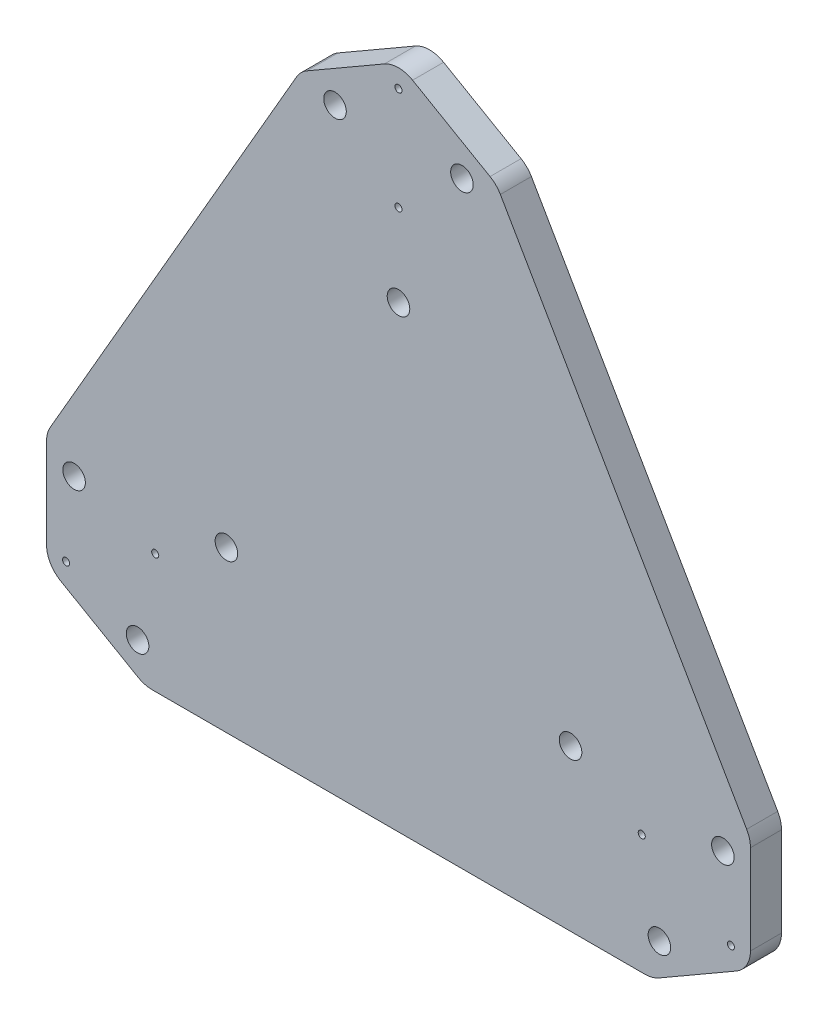
ISO-10303-21;
HEADER;
FILE_DESCRIPTION(('STEP AP214'),'2;1');
FILE_NAME('part.step','',(''),(''),'','','');
FILE_SCHEMA(('AUTOMOTIVE_DESIGN { 1 0 10303 214 1 1 1 1 }'));
ENDSEC;
DATA;
#1=APPLICATION_CONTEXT('core data for automotive mechanical design processes');
#2=APPLICATION_PROTOCOL_DEFINITION('international standard','automotive_design',2000,#1);
#3=PRODUCT_CONTEXT('',#1,'mechanical');
#4=PRODUCT('Part','Part','',(#3));
#5=PRODUCT_RELATED_PRODUCT_CATEGORY('part','',(#4));
#6=PRODUCT_DEFINITION_FORMATION('','',#4);
#7=PRODUCT_DEFINITION_CONTEXT('part definition',#1,'design');
#8=PRODUCT_DEFINITION('design','',#6,#7);
#9=PRODUCT_DEFINITION_SHAPE('','',#8);
#10=(LENGTH_UNIT() NAMED_UNIT(*) SI_UNIT(.MILLI.,.METRE.));
#11=(NAMED_UNIT(*) PLANE_ANGLE_UNIT() SI_UNIT($,.RADIAN.));
#12=(NAMED_UNIT(*) SI_UNIT($,.STERADIAN.) SOLID_ANGLE_UNIT());
#13=UNCERTAINTY_MEASURE_WITH_UNIT(LENGTH_MEASURE(1.E-05),#10,'distance_accuracy_value','');
#14=(GEOMETRIC_REPRESENTATION_CONTEXT(3) GLOBAL_UNCERTAINTY_ASSIGNED_CONTEXT((#13)) GLOBAL_UNIT_ASSIGNED_CONTEXT((#10,
#11,#12)) REPRESENTATION_CONTEXT('',''));
#15=CARTESIAN_POINT('',(0.,0.,0.));
#16=DIRECTION('',(0.,0.,1.));
#17=DIRECTION('',(1.,0.,0.));
#18=AXIS2_PLACEMENT_3D('',#15,#16,#17);
#19=CARTESIAN_POINT('',(0.,0.,11.));
#20=DIRECTION('',(0.,0.,-1.));
#21=DIRECTION('',(-1.,0.,0.));
#22=AXIS2_PLACEMENT_3D('',#19,#20,#21);
#23=PLANE('',#22);
#24=CARTESIAN_POINT('',(92.5,-79.3856620135732,11.));
#25=DIRECTION('',(0.,0.,1.));
#26=DIRECTION('',(1.,0.,0.));
#27=AXIS2_PLACEMENT_3D('',#24,#25,#26);
#28=CIRCLE('',#27,3.99999999999999);
#29=CARTESIAN_POINT('',(96.5,-79.3856620135732,11.));
#30=VERTEX_POINT('',#29);
#31=EDGE_CURVE('E389',#30,#30,#28,.T.);
#32=ORIENTED_EDGE('',*,*,#31,.F.);
#33=EDGE_LOOP('',(#32));
#34=FACE_BOUND('',#33,.T.);
#35=CARTESIAN_POINT('',(-115.,-40.4145188432734,11.));
#36=DIRECTION('',(0.,0.,1.));
#37=DIRECTION('',(1.,0.,0.));
#38=AXIS2_PLACEMENT_3D('',#35,#36,#37);
#39=CIRCLE('',#38,4.00000000000001);
#40=CARTESIAN_POINT('',(-111.,-40.4145188432734,11.));
#41=VERTEX_POINT('',#40);
#42=EDGE_CURVE('E377',#41,#41,#39,.T.);
#43=ORIENTED_EDGE('',*,*,#42,.F.);
#44=EDGE_LOOP('',(#43));
#45=FACE_BOUND('',#44,.T.);
#46=CARTESIAN_POINT('',(22.5,119.800180856848,11.));
#47=DIRECTION('',(0.,0.,1.));
#48=DIRECTION('',(1.,0.,0.));
#49=AXIS2_PLACEMENT_3D('',#46,#47,#48);
#50=CIRCLE('',#49,4.);
#51=CARTESIAN_POINT('',(26.5,119.800180856848,11.));
#52=VERTEX_POINT('',#51);
#53=EDGE_CURVE('E365',#52,#52,#50,.T.);
#54=ORIENTED_EDGE('',*,*,#53,.F.);
#55=EDGE_LOOP('',(#54));
#56=FACE_BOUND('',#55,.T.);
#57=CARTESIAN_POINT('',(0.,70.4367328411345,11.));
#58=DIRECTION('',(0.,0.,1.));
#59=DIRECTION('',(1.,0.,0.));
#60=AXIS2_PLACEMENT_3D('',#57,#58,#59);
#61=CIRCLE('',#60,4.);
#62=CARTESIAN_POINT('',(4.,70.4367328411345,11.));
#63=VERTEX_POINT('',#62);
#64=EDGE_CURVE('E353',#63,#63,#61,.T.);
#65=ORIENTED_EDGE('',*,*,#64,.F.);
#66=EDGE_LOOP('',(#65));
#67=FACE_BOUND('',#66,.T.);
#68=CARTESIAN_POINT('',(86.2400727618683,-49.7907292239972,11.));
#69=DIRECTION('',(0.,0.,1.));
#70=DIRECTION('',(1.,0.,0.));
#71=AXIS2_PLACEMENT_3D('',#68,#69,#70);
#72=CIRCLE('',#71,1.25);
#73=CARTESIAN_POINT('',(87.4900727618683,-49.7907292239972,11.));
#74=VERTEX_POINT('',#73);
#75=EDGE_CURVE('E341',#74,#74,#72,.T.);
#76=ORIENTED_EDGE('',*,*,#75,.F.);
#77=EDGE_LOOP('',(#76));
#78=FACE_BOUND('',#77,.T.);
#79=CARTESIAN_POINT('',(-86.2400727618682,-49.7907292239972,11.));
#80=DIRECTION('',(0.,0.,1.));
#81=DIRECTION('',(1.,0.,0.));
#82=AXIS2_PLACEMENT_3D('',#79,#80,#81);
#83=CIRCLE('',#82,1.24999999999995);
#84=CARTESIAN_POINT('',(-84.9900727618683,-49.7907292239972,11.));
#85=VERTEX_POINT('',#84);
#86=EDGE_CURVE('E329',#85,#85,#83,.T.);
#87=ORIENTED_EDGE('',*,*,#86,.F.);
#88=EDGE_LOOP('',(#87));
#89=FACE_BOUND('',#88,.T.);
#90=CARTESIAN_POINT('',(117.85,-68.0407292239971,11.));
#91=DIRECTION('',(0.,0.,1.));
#92=DIRECTION('',(1.,0.,0.));
#93=AXIS2_PLACEMENT_3D('',#90,#91,#92);
#94=CIRCLE('',#93,1.24999999999999);
#95=CARTESIAN_POINT('',(119.1,-68.0407292239971,11.));
#96=VERTEX_POINT('',#95);
#97=EDGE_CURVE('E317',#96,#96,#94,.T.);
#98=ORIENTED_EDGE('',*,*,#97,.F.);
#99=EDGE_LOOP('',(#98));
#100=FACE_BOUND('',#99,.T.);
#101=DIRECTION('',(0.866025403784438,-0.5,0.));
#102=VECTOR('',#101,1.);
#103=CARTESIAN_POINT('',(-90.,-92.1199342209286,11.));
#104=LINE('',#103,#102);
#105=CARTESIAN_POINT('',(-119.778203230276,-74.9274805699455,11.));
#106=VERTEX_POINT('',#105);
#107=CARTESIAN_POINT('',(-92.3205080756888,-90.780188258773,11.));
#108=VERTEX_POINT('',#107);
#109=EDGE_CURVE('E281',#106,#108,#104,.T.);
#110=ORIENTED_EDGE('',*,*,#109,.T.);
#111=CARTESIAN_POINT('',(-87.3205080756888,-82.1199342209286,11.));
#112=DIRECTION('',(0.,0.,-1.));
#113=DIRECTION('',(-1.,0.,0.));
#114=AXIS2_PLACEMENT_3D('',#111,#112,#113);
#115=CIRCLE('',#114,10.);
#116=CARTESIAN_POINT('',(-87.3205080756887,-92.1199342209286,11.));
#117=VERTEX_POINT('',#116);
#118=EDGE_CURVE('E235',#108,#117,#115,.F.);
#119=ORIENTED_EDGE('',*,*,#118,.T.);
#120=DIRECTION('',(1.,0.,0.));
#121=VECTOR('',#120,1.);
#122=CARTESIAN_POINT('',(90.,-92.1199342209285,11.));
#123=LINE('',#122,#121);
#124=CARTESIAN_POINT('',(87.3205080756887,-92.1199342209285,11.));
#125=VERTEX_POINT('',#124);
#126=EDGE_CURVE('E179',#117,#125,#123,.T.);
#127=ORIENTED_EDGE('',*,*,#126,.T.);
#128=CARTESIAN_POINT('',(87.3205080756887,-82.1199342209285,11.));
#129=DIRECTION('',(0.,0.,-1.));
#130=DIRECTION('',(-1.,0.,0.));
#131=AXIS2_PLACEMENT_3D('',#128,#129,#130);
#132=CIRCLE('',#131,10.);
#133=CARTESIAN_POINT('',(92.3205080756887,-90.780188258773,11.));
#134=VERTEX_POINT('',#133);
#135=EDGE_CURVE('E233',#125,#134,#132,.F.);
#136=ORIENTED_EDGE('',*,*,#135,.T.);
#137=DIRECTION('',(0.866025403784439,0.499999999999999,0.));
#138=VECTOR('',#137,1.);
#139=CARTESIAN_POINT('',(90.,-92.1199342209285,11.));
#140=LINE('',#139,#138);
#141=CARTESIAN_POINT('',(119.778203230276,-74.9274805699456,11.));
#142=VERTEX_POINT('',#141);
#143=EDGE_CURVE('E303',#134,#142,#140,.T.);
#144=ORIENTED_EDGE('',*,*,#143,.T.);
#145=CARTESIAN_POINT('',(114.778203230276,-66.2672265321012,11.));
#146=DIRECTION('',(0.,0.,-1.));
#147=DIRECTION('',(-1.,0.,0.));
#148=AXIS2_PLACEMENT_3D('',#145,#146,#147);
#149=CIRCLE('',#148,10.);
#150=CARTESIAN_POINT('',(124.778203230276,-66.2672265321012,11.));
#151=VERTEX_POINT('',#150);
#152=EDGE_CURVE('E222',#142,#151,#149,.F.);
#153=ORIENTED_EDGE('',*,*,#152,.T.);
#154=DIRECTION('',(0.,1.,0.));
#155=VECTOR('',#154,1.);
#156=CARTESIAN_POINT('',(124.778203230276,-31.8823192301352,11.));
#157=LINE('',#156,#155);
#158=CARTESIAN_POINT('',(124.778203230276,-34.5618111544465,11.));
#159=VERTEX_POINT('',#158);
#160=EDGE_CURVE('E301',#151,#159,#157,.T.);
#161=ORIENTED_EDGE('',*,*,#160,.T.);
#162=CARTESIAN_POINT('',(114.778203230276,-34.5618111544465,11.));
#163=DIRECTION('',(0.,0.,-1.));
#164=DIRECTION('',(-1.,0.,0.));
#165=AXIS2_PLACEMENT_3D('',#162,#163,#164);
#166=CIRCLE('',#165,10.);
#167=CARTESIAN_POINT('',(123.43845726812,-29.5618111544464,11.));
#168=VERTEX_POINT('',#167);
#169=EDGE_CURVE('E54',#159,#168,#166,.F.);
#170=ORIENTED_EDGE('',*,*,#169,.T.);
#171=DIRECTION('',(-0.5,0.866025403784439,0.));
#172=VECTOR('',#171,1.);
#173=CARTESIAN_POINT('',(34.7782032302756,124.002253451064,11.));
#174=LINE('',#173,#172);
#175=CARTESIAN_POINT('',(36.1179491924312,121.681745375375,11.));
#176=VERTEX_POINT('',#175);
#177=EDGE_CURVE('E201',#168,#176,#174,.T.);
#178=ORIENTED_EDGE('',*,*,#177,.T.);
#179=CARTESIAN_POINT('',(27.4576951545868,116.681745375375,11.));
#180=DIRECTION('',(0.,0.,-1.));
#181=DIRECTION('',(-1.,0.,0.));
#182=AXIS2_PLACEMENT_3D('',#179,#180,#181);
#183=CIRCLE('',#182,10.);
#184=CARTESIAN_POINT('',(32.4576951545868,125.341999413219,11.));
#185=VERTEX_POINT('',#184);
#186=EDGE_CURVE('E230',#176,#185,#183,.F.);
#187=ORIENTED_EDGE('',*,*,#186,.T.);
#188=DIRECTION('',(-0.866025403784438,0.500000000000001,0.));
#189=VECTOR('',#188,1.);
#190=CARTESIAN_POINT('',(34.7782032302756,124.002253451064,11.));
#191=LINE('',#190,#189);
#192=CARTESIAN_POINT('',(5.00000000000002,141.194707102047,11.));
#193=VERTEX_POINT('',#192);
#194=EDGE_CURVE('E200',#185,#193,#191,.T.);
#195=ORIENTED_EDGE('',*,*,#194,.T.);
#196=CARTESIAN_POINT('',(0.,132.534453064202,11.));
#197=DIRECTION('',(0.,0.,-1.));
#198=DIRECTION('',(-1.,0.,0.));
#199=AXIS2_PLACEMENT_3D('',#196,#197,#198);
#200=CIRCLE('',#199,10.);
#201=CARTESIAN_POINT('',(-5.00000000000002,141.194707102047,11.));
#202=VERTEX_POINT('',#201);
#203=EDGE_CURVE('E220',#193,#202,#200,.F.);
#204=ORIENTED_EDGE('',*,*,#203,.T.);
#205=DIRECTION('',(-0.866025403784439,-0.5,0.));
#206=VECTOR('',#205,1.);
#207=CARTESIAN_POINT('',(-34.7782032302757,124.002253451064,11.));
#208=LINE('',#207,#206);
#209=CARTESIAN_POINT('',(-32.4576951545869,125.341999413219,11.));
#210=VERTEX_POINT('',#209);
#211=EDGE_CURVE('E309',#202,#210,#208,.T.);
#212=ORIENTED_EDGE('',*,*,#211,.T.);
#213=CARTESIAN_POINT('',(-27.4576951545869,116.681745375375,11.));
#214=DIRECTION('',(0.,0.,-1.));
#215=DIRECTION('',(-1.,0.,0.));
#216=AXIS2_PLACEMENT_3D('',#213,#214,#215);
#217=CIRCLE('',#216,10.);
#218=CARTESIAN_POINT('',(-36.1179491924313,121.681745375375,11.));
#219=VERTEX_POINT('',#218);
#220=EDGE_CURVE('E228',#210,#219,#217,.F.);
#221=ORIENTED_EDGE('',*,*,#220,.T.);
#222=DIRECTION('',(-0.5,-0.866025403784439,0.));
#223=VECTOR('',#222,1.);
#224=CARTESIAN_POINT('',(-124.778203230276,-31.8823192301352,11.));
#225=LINE('',#224,#223);
#226=CARTESIAN_POINT('',(-123.43845726812,-29.5618111544465,11.));
#227=VERTEX_POINT('',#226);
#228=EDGE_CURVE('E282',#219,#227,#225,.T.);
#229=ORIENTED_EDGE('',*,*,#228,.T.);
#230=CARTESIAN_POINT('',(-114.778203230276,-34.5618111544464,11.));
#231=DIRECTION('',(0.,0.,-1.));
#232=DIRECTION('',(-1.,0.,0.));
#233=AXIS2_PLACEMENT_3D('',#230,#231,#232);
#234=CIRCLE('',#233,10.);
#235=CARTESIAN_POINT('',(-124.778203230276,-34.5618111544464,11.));
#236=VERTEX_POINT('',#235);
#237=EDGE_CURVE('E226',#227,#236,#234,.F.);
#238=ORIENTED_EDGE('',*,*,#237,.T.);
#239=DIRECTION('',(0.,-1.,0.));
#240=VECTOR('',#239,1.);
#241=CARTESIAN_POINT('',(-124.778203230276,-31.8823192301352,11.));
#242=LINE('',#241,#240);
#243=CARTESIAN_POINT('',(-124.778203230276,-66.2672265321011,11.));
#244=VERTEX_POINT('',#243);
#245=EDGE_CURVE('E271',#236,#244,#242,.T.);
#246=ORIENTED_EDGE('',*,*,#245,.T.);
#247=CARTESIAN_POINT('',(-114.778203230276,-66.2672265321011,11.));
#248=DIRECTION('',(0.,0.,-1.));
#249=DIRECTION('',(-1.,0.,0.));
#250=AXIS2_PLACEMENT_3D('',#247,#248,#249);
#251=CIRCLE('',#250,10.);
#252=EDGE_CURVE('E224',#244,#106,#251,.F.);
#253=ORIENTED_EDGE('',*,*,#252,.T.);
#254=EDGE_LOOP('',(#110,#119,#127,#136,#144,#153,#161,#170,#178,#187,#195,#204,#212,#221,#229,
#238,#246,#253));
#255=FACE_BOUND('',#254,.T.);
#256=CARTESIAN_POINT('',(-117.85,-68.0407292239972,11.));
#257=DIRECTION('',(0.,0.,1.));
#258=DIRECTION('',(1.,0.,0.));
#259=AXIS2_PLACEMENT_3D('',#256,#257,#258);
#260=CIRCLE('',#259,1.25000000000005);
#261=CARTESIAN_POINT('',(-116.6,-68.0407292239972,11.));
#262=VERTEX_POINT('',#261);
#263=EDGE_CURVE('E299',#262,#262,#260,.T.);
#264=ORIENTED_EDGE('',*,*,#263,.F.);
#265=EDGE_LOOP('',(#264));
#266=FACE_BOUND('',#265,.T.);
#267=CARTESIAN_POINT('',(0.,136.081458447995,11.));
#268=DIRECTION('',(0.,0.,1.));
#269=DIRECTION('',(1.,0.,0.));
#270=AXIS2_PLACEMENT_3D('',#267,#268,#269);
#271=CIRCLE('',#270,1.24999999999999);
#272=CARTESIAN_POINT('',(1.24999999999999,136.081458447995,11.));
#273=VERTEX_POINT('',#272);
#274=EDGE_CURVE('E323',#273,#273,#271,.T.);
#275=ORIENTED_EDGE('',*,*,#274,.F.);
#276=EDGE_LOOP('',(#275));
#277=FACE_BOUND('',#276,.T.);
#278=CARTESIAN_POINT('',(0.,99.5814584479949,11.));
#279=DIRECTION('',(0.,0.,1.));
#280=DIRECTION('',(1.,0.,0.));
#281=AXIS2_PLACEMENT_3D('',#278,#279,#280);
#282=CIRCLE('',#281,1.25000000000001);
#283=CARTESIAN_POINT('',(1.25000000000001,99.5814584479949,11.));
#284=VERTEX_POINT('',#283);
#285=EDGE_CURVE('E335',#284,#284,#282,.T.);
#286=ORIENTED_EDGE('',*,*,#285,.F.);
#287=EDGE_LOOP('',(#286));
#288=FACE_BOUND('',#287,.T.);
#289=CARTESIAN_POINT('',(-61.,-35.218366420567,11.));
#290=DIRECTION('',(0.,0.,1.));
#291=DIRECTION('',(1.,0.,0.));
#292=AXIS2_PLACEMENT_3D('',#289,#290,#291);
#293=CIRCLE('',#292,4.);
#294=CARTESIAN_POINT('',(-57.,-35.218366420567,11.));
#295=VERTEX_POINT('',#294);
#296=EDGE_CURVE('E347',#295,#295,#293,.T.);
#297=ORIENTED_EDGE('',*,*,#296,.F.);
#298=EDGE_LOOP('',(#297));
#299=FACE_BOUND('',#298,.T.);
#300=CARTESIAN_POINT('',(61.,-35.218366420567,11.));
#301=DIRECTION('',(0.,0.,1.));
#302=DIRECTION('',(1.,0.,0.));
#303=AXIS2_PLACEMENT_3D('',#300,#301,#302);
#304=CIRCLE('',#303,4.00000000000001);
#305=CARTESIAN_POINT('',(65.,-35.218366420567,11.));
#306=VERTEX_POINT('',#305);
#307=EDGE_CURVE('E359',#306,#306,#304,.T.);
#308=ORIENTED_EDGE('',*,*,#307,.F.);
#309=EDGE_LOOP('',(#308));
#310=FACE_BOUND('',#309,.T.);
#311=CARTESIAN_POINT('',(-22.5,119.800180856848,11.));
#312=DIRECTION('',(0.,0.,1.));
#313=DIRECTION('',(1.,0.,0.));
#314=AXIS2_PLACEMENT_3D('',#311,#312,#313);
#315=CIRCLE('',#314,4.);
#316=CARTESIAN_POINT('',(-18.5,119.800180856848,11.));
#317=VERTEX_POINT('',#316);
#318=EDGE_CURVE('E371',#317,#317,#315,.T.);
#319=ORIENTED_EDGE('',*,*,#318,.F.);
#320=EDGE_LOOP('',(#319));
#321=FACE_BOUND('',#320,.T.);
#322=CARTESIAN_POINT('',(-92.5,-79.3856620135732,11.));
#323=DIRECTION('',(0.,0.,1.));
#324=DIRECTION('',(1.,0.,0.));
#325=AXIS2_PLACEMENT_3D('',#322,#323,#324);
#326=CIRCLE('',#325,3.99999999999999);
#327=CARTESIAN_POINT('',(-88.5,-79.3856620135732,11.));
#328=VERTEX_POINT('',#327);
#329=EDGE_CURVE('E383',#328,#328,#326,.T.);
#330=ORIENTED_EDGE('',*,*,#329,.F.);
#331=EDGE_LOOP('',(#330));
#332=FACE_BOUND('',#331,.T.);
#333=CARTESIAN_POINT('',(115.,-40.4145188432734,11.));
#334=DIRECTION('',(0.,0.,1.));
#335=DIRECTION('',(1.,0.,0.));
#336=AXIS2_PLACEMENT_3D('',#333,#334,#335);
#337=CIRCLE('',#336,3.99999999999999);
#338=CARTESIAN_POINT('',(119.,-40.4145188432734,11.));
#339=VERTEX_POINT('',#338);
#340=EDGE_CURVE('E395',#339,#339,#337,.T.);
#341=ORIENTED_EDGE('',*,*,#340,.F.);
#342=EDGE_LOOP('',(#341));
#343=FACE_BOUND('',#342,.T.);
#344=ADVANCED_FACE('F32',(#34,#45,#56,#67,#78,#89,#100,#255,#266,#277,#288,#299,#310,#321,#332,
#343),#23,.F.);
#345=CARTESIAN_POINT('',(0.,0.,0.));
#346=DIRECTION('',(0.,0.,-1.));
#347=DIRECTION('',(-1.,0.,0.));
#348=AXIS2_PLACEMENT_3D('',#345,#346,#347);
#349=PLANE('',#348);
#350=CARTESIAN_POINT('',(92.5,-79.3856620135732,0.));
#351=DIRECTION('',(0.,0.,1.));
#352=DIRECTION('',(1.,0.,0.));
#353=AXIS2_PLACEMENT_3D('',#350,#351,#352);
#354=CIRCLE('',#353,3.99999999999999);
#355=CARTESIAN_POINT('',(96.5,-79.3856620135732,0.));
#356=VERTEX_POINT('',#355);
#357=EDGE_CURVE('E392',#356,#356,#354,.T.);
#358=ORIENTED_EDGE('',*,*,#357,.T.);
#359=EDGE_LOOP('',(#358));
#360=FACE_BOUND('',#359,.T.);
#361=CARTESIAN_POINT('',(-115.,-40.4145188432734,0.));
#362=DIRECTION('',(0.,0.,1.));
#363=DIRECTION('',(1.,0.,0.));
#364=AXIS2_PLACEMENT_3D('',#361,#362,#363);
#365=CIRCLE('',#364,4.00000000000001);
#366=CARTESIAN_POINT('',(-111.,-40.4145188432734,0.));
#367=VERTEX_POINT('',#366);
#368=EDGE_CURVE('E380',#367,#367,#365,.T.);
#369=ORIENTED_EDGE('',*,*,#368,.T.);
#370=EDGE_LOOP('',(#369));
#371=FACE_BOUND('',#370,.T.);
#372=CARTESIAN_POINT('',(22.5,119.800180856848,0.));
#373=DIRECTION('',(0.,0.,1.));
#374=DIRECTION('',(1.,0.,0.));
#375=AXIS2_PLACEMENT_3D('',#372,#373,#374);
#376=CIRCLE('',#375,4.);
#377=CARTESIAN_POINT('',(26.5,119.800180856848,0.));
#378=VERTEX_POINT('',#377);
#379=EDGE_CURVE('E368',#378,#378,#376,.T.);
#380=ORIENTED_EDGE('',*,*,#379,.T.);
#381=EDGE_LOOP('',(#380));
#382=FACE_BOUND('',#381,.T.);
#383=CARTESIAN_POINT('',(0.,70.4367328411345,0.));
#384=DIRECTION('',(0.,0.,1.));
#385=DIRECTION('',(1.,0.,0.));
#386=AXIS2_PLACEMENT_3D('',#383,#384,#385);
#387=CIRCLE('',#386,4.);
#388=CARTESIAN_POINT('',(4.,70.4367328411345,0.));
#389=VERTEX_POINT('',#388);
#390=EDGE_CURVE('E356',#389,#389,#387,.T.);
#391=ORIENTED_EDGE('',*,*,#390,.T.);
#392=EDGE_LOOP('',(#391));
#393=FACE_BOUND('',#392,.T.);
#394=CARTESIAN_POINT('',(86.2400727618683,-49.7907292239972,0.));
#395=DIRECTION('',(0.,0.,1.));
#396=DIRECTION('',(1.,0.,0.));
#397=AXIS2_PLACEMENT_3D('',#394,#395,#396);
#398=CIRCLE('',#397,1.25);
#399=CARTESIAN_POINT('',(87.4900727618683,-49.7907292239972,0.));
#400=VERTEX_POINT('',#399);
#401=EDGE_CURVE('E344',#400,#400,#398,.T.);
#402=ORIENTED_EDGE('',*,*,#401,.T.);
#403=EDGE_LOOP('',(#402));
#404=FACE_BOUND('',#403,.T.);
#405=CARTESIAN_POINT('',(-86.2400727618682,-49.7907292239972,0.));
#406=DIRECTION('',(0.,0.,1.));
#407=DIRECTION('',(1.,0.,0.));
#408=AXIS2_PLACEMENT_3D('',#405,#406,#407);
#409=CIRCLE('',#408,1.24999999999995);
#410=CARTESIAN_POINT('',(-84.9900727618683,-49.7907292239972,0.));
#411=VERTEX_POINT('',#410);
#412=EDGE_CURVE('E332',#411,#411,#409,.T.);
#413=ORIENTED_EDGE('',*,*,#412,.T.);
#414=EDGE_LOOP('',(#413));
#415=FACE_BOUND('',#414,.T.);
#416=CARTESIAN_POINT('',(117.85,-68.0407292239971,0.));
#417=DIRECTION('',(0.,0.,1.));
#418=DIRECTION('',(1.,0.,0.));
#419=AXIS2_PLACEMENT_3D('',#416,#417,#418);
#420=CIRCLE('',#419,1.24999999999999);
#421=CARTESIAN_POINT('',(119.1,-68.0407292239971,0.));
#422=VERTEX_POINT('',#421);
#423=EDGE_CURVE('E320',#422,#422,#420,.T.);
#424=ORIENTED_EDGE('',*,*,#423,.T.);
#425=EDGE_LOOP('',(#424));
#426=FACE_BOUND('',#425,.T.);
#427=DIRECTION('',(1.,0.,0.));
#428=VECTOR('',#427,1.);
#429=CARTESIAN_POINT('',(90.,-92.1199342209285,0.));
#430=LINE('',#429,#428);
#431=CARTESIAN_POINT('',(-87.3205080756887,-92.1199342209286,0.));
#432=VERTEX_POINT('',#431);
#433=CARTESIAN_POINT('',(87.3205080756887,-92.1199342209285,0.));
#434=VERTEX_POINT('',#433);
#435=EDGE_CURVE('E176',#432,#434,#430,.T.);
#436=ORIENTED_EDGE('',*,*,#435,.F.);
#437=CARTESIAN_POINT('',(-87.3205080756888,-82.1199342209286,0.));
#438=DIRECTION('',(0.,0.,-1.));
#439=DIRECTION('',(-1.,0.,0.));
#440=AXIS2_PLACEMENT_3D('',#437,#438,#439);
#441=CIRCLE('',#440,10.);
#442=CARTESIAN_POINT('',(-92.3205080756888,-90.780188258773,0.));
#443=VERTEX_POINT('',#442);
#444=EDGE_CURVE('E159',#432,#443,#441,.T.);
#445=ORIENTED_EDGE('',*,*,#444,.T.);
#446=DIRECTION('',(0.866025403784438,-0.5,0.));
#447=VECTOR('',#446,1.);
#448=CARTESIAN_POINT('',(-90.,-92.1199342209286,0.));
#449=LINE('',#448,#447);
#450=CARTESIAN_POINT('',(-119.778203230276,-74.9274805699455,0.));
#451=VERTEX_POINT('',#450);
#452=EDGE_CURVE('E187',#451,#443,#449,.T.);
#453=ORIENTED_EDGE('',*,*,#452,.F.);
#454=CARTESIAN_POINT('',(-114.778203230276,-66.2672265321011,0.));
#455=DIRECTION('',(0.,0.,-1.));
#456=DIRECTION('',(-1.,0.,0.));
#457=AXIS2_PLACEMENT_3D('',#454,#455,#456);
#458=CIRCLE('',#457,10.);
#459=CARTESIAN_POINT('',(-124.778203230276,-66.2672265321011,0.));
#460=VERTEX_POINT('',#459);
#461=EDGE_CURVE('E206',#451,#460,#458,.T.);
#462=ORIENTED_EDGE('',*,*,#461,.T.);
#463=DIRECTION('',(0.,-1.,0.));
#464=VECTOR('',#463,1.);
#465=CARTESIAN_POINT('',(-124.778203230276,-31.8823192301352,0.));
#466=LINE('',#465,#464);
#467=CARTESIAN_POINT('',(-124.778203230276,-34.5618111544464,0.));
#468=VERTEX_POINT('',#467);
#469=EDGE_CURVE('E192',#468,#460,#466,.T.);
#470=ORIENTED_EDGE('',*,*,#469,.F.);
#471=CARTESIAN_POINT('',(-114.778203230276,-34.5618111544464,0.));
#472=DIRECTION('',(0.,0.,-1.));
#473=DIRECTION('',(-1.,0.,0.));
#474=AXIS2_PLACEMENT_3D('',#471,#472,#473);
#475=CIRCLE('',#474,10.);
#476=CARTESIAN_POINT('',(-123.43845726812,-29.5618111544465,0.));
#477=VERTEX_POINT('',#476);
#478=EDGE_CURVE('E208',#468,#477,#475,.T.);
#479=ORIENTED_EDGE('',*,*,#478,.T.);
#480=DIRECTION('',(-0.5,-0.866025403784439,0.));
#481=VECTOR('',#480,1.);
#482=CARTESIAN_POINT('',(-124.778203230276,-31.8823192301352,0.));
#483=LINE('',#482,#481);
#484=CARTESIAN_POINT('',(-36.1179491924313,121.681745375375,0.));
#485=VERTEX_POINT('',#484);
#486=EDGE_CURVE('E290',#485,#477,#483,.T.);
#487=ORIENTED_EDGE('',*,*,#486,.F.);
#488=CARTESIAN_POINT('',(-27.4576951545869,116.681745375375,0.));
#489=DIRECTION('',(0.,0.,-1.));
#490=DIRECTION('',(-1.,0.,0.));
#491=AXIS2_PLACEMENT_3D('',#488,#489,#490);
#492=CIRCLE('',#491,10.);
#493=CARTESIAN_POINT('',(-32.4576951545869,125.341999413219,0.));
#494=VERTEX_POINT('',#493);
#495=EDGE_CURVE('E210',#485,#494,#492,.T.);
#496=ORIENTED_EDGE('',*,*,#495,.T.);
#497=DIRECTION('',(-0.866025403784439,-0.5,0.));
#498=VECTOR('',#497,1.);
#499=CARTESIAN_POINT('',(-34.7782032302757,124.002253451064,0.));
#500=LINE('',#499,#498);
#501=CARTESIAN_POINT('',(-5.00000000000002,141.194707102047,0.));
#502=VERTEX_POINT('',#501);
#503=EDGE_CURVE('E291',#502,#494,#500,.T.);
#504=ORIENTED_EDGE('',*,*,#503,.F.);
#505=CARTESIAN_POINT('',(0.,132.534453064202,0.));
#506=DIRECTION('',(0.,0.,-1.));
#507=DIRECTION('',(-1.,0.,0.));
#508=AXIS2_PLACEMENT_3D('',#505,#506,#507);
#509=CIRCLE('',#508,10.);
#510=CARTESIAN_POINT('',(5.00000000000002,141.194707102047,0.));
#511=VERTEX_POINT('',#510);
#512=EDGE_CURVE('E180',#502,#511,#509,.T.);
#513=ORIENTED_EDGE('',*,*,#512,.T.);
#514=DIRECTION('',(-0.866025403784438,0.500000000000001,0.));
#515=VECTOR('',#514,1.);
#516=CARTESIAN_POINT('',(34.7782032302756,124.002253451064,0.));
#517=LINE('',#516,#515);
#518=CARTESIAN_POINT('',(32.4576951545868,125.341999413219,0.));
#519=VERTEX_POINT('',#518);
#520=EDGE_CURVE('E296',#519,#511,#517,.T.);
#521=ORIENTED_EDGE('',*,*,#520,.F.);
#522=CARTESIAN_POINT('',(27.4576951545868,116.681745375375,0.));
#523=DIRECTION('',(0.,0.,-1.));
#524=DIRECTION('',(-1.,0.,0.));
#525=AXIS2_PLACEMENT_3D('',#522,#523,#524);
#526=CIRCLE('',#525,10.);
#527=CARTESIAN_POINT('',(36.1179491924312,121.681745375375,0.));
#528=VERTEX_POINT('',#527);
#529=EDGE_CURVE('E212',#519,#528,#526,.T.);
#530=ORIENTED_EDGE('',*,*,#529,.T.);
#531=DIRECTION('',(-0.5,0.866025403784439,0.));
#532=VECTOR('',#531,1.);
#533=CARTESIAN_POINT('',(34.7782032302756,124.002253451064,0.));
#534=LINE('',#533,#532);
#535=CARTESIAN_POINT('',(123.43845726812,-29.5618111544464,0.));
#536=VERTEX_POINT('',#535);
#537=EDGE_CURVE('E198',#536,#528,#534,.T.);
#538=ORIENTED_EDGE('',*,*,#537,.F.);
#539=CARTESIAN_POINT('',(114.778203230276,-34.5618111544465,0.));
#540=DIRECTION('',(0.,0.,-1.));
#541=DIRECTION('',(-1.,0.,0.));
#542=AXIS2_PLACEMENT_3D('',#539,#540,#541);
#543=CIRCLE('',#542,10.);
#544=CARTESIAN_POINT('',(124.778203230276,-34.5618111544465,0.));
#545=VERTEX_POINT('',#544);
#546=EDGE_CURVE('E214',#536,#545,#543,.T.);
#547=ORIENTED_EDGE('',*,*,#546,.T.);
#548=DIRECTION('',(0.,1.,0.));
#549=VECTOR('',#548,1.);
#550=CARTESIAN_POINT('',(124.778203230276,-31.8823192301352,0.));
#551=LINE('',#550,#549);
#552=CARTESIAN_POINT('',(124.778203230276,-66.2672265321012,0.));
#553=VERTEX_POINT('',#552);
#554=EDGE_CURVE('E190',#553,#545,#551,.T.);
#555=ORIENTED_EDGE('',*,*,#554,.F.);
#556=CARTESIAN_POINT('',(114.778203230276,-66.2672265321012,0.));
#557=DIRECTION('',(0.,0.,-1.));
#558=DIRECTION('',(-1.,0.,0.));
#559=AXIS2_PLACEMENT_3D('',#556,#557,#558);
#560=CIRCLE('',#559,10.);
#561=CARTESIAN_POINT('',(119.778203230276,-74.9274805699456,0.));
#562=VERTEX_POINT('',#561);
#563=EDGE_CURVE('E204',#553,#562,#560,.T.);
#564=ORIENTED_EDGE('',*,*,#563,.T.);
#565=DIRECTION('',(0.866025403784439,0.499999999999999,0.));
#566=VECTOR('',#565,1.);
#567=CARTESIAN_POINT('',(90.,-92.1199342209285,0.));
#568=LINE('',#567,#566);
#569=CARTESIAN_POINT('',(92.3205080756887,-90.780188258773,0.));
#570=VERTEX_POINT('',#569);
#571=EDGE_CURVE('E186',#570,#562,#568,.T.);
#572=ORIENTED_EDGE('',*,*,#571,.F.);
#573=CARTESIAN_POINT('',(87.3205080756887,-82.1199342209285,0.));
#574=DIRECTION('',(0.,0.,-1.));
#575=DIRECTION('',(-1.,0.,0.));
#576=AXIS2_PLACEMENT_3D('',#573,#574,#575);
#577=CIRCLE('',#576,10.);
#578=EDGE_CURVE('E170',#570,#434,#577,.T.);
#579=ORIENTED_EDGE('',*,*,#578,.T.);
#580=EDGE_LOOP('',(#436,#445,#453,#462,#470,#479,#487,#496,#504,#513,#521,#530,#538,#547,#555,
#564,#572,#579));
#581=FACE_BOUND('',#580,.T.);
#582=CARTESIAN_POINT('',(-117.85,-68.0407292239972,0.));
#583=DIRECTION('',(0.,0.,1.));
#584=DIRECTION('',(1.,0.,0.));
#585=AXIS2_PLACEMENT_3D('',#582,#583,#584);
#586=CIRCLE('',#585,1.25000000000005);
#587=CARTESIAN_POINT('',(-116.6,-68.0407292239972,0.));
#588=VERTEX_POINT('',#587);
#589=EDGE_CURVE('E314',#588,#588,#586,.T.);
#590=ORIENTED_EDGE('',*,*,#589,.T.);
#591=EDGE_LOOP('',(#590));
#592=FACE_BOUND('',#591,.T.);
#593=CARTESIAN_POINT('',(0.,136.081458447995,0.));
#594=DIRECTION('',(0.,0.,1.));
#595=DIRECTION('',(1.,0.,0.));
#596=AXIS2_PLACEMENT_3D('',#593,#594,#595);
#597=CIRCLE('',#596,1.24999999999999);
#598=CARTESIAN_POINT('',(1.24999999999999,136.081458447995,0.));
#599=VERTEX_POINT('',#598);
#600=EDGE_CURVE('E326',#599,#599,#597,.T.);
#601=ORIENTED_EDGE('',*,*,#600,.T.);
#602=EDGE_LOOP('',(#601));
#603=FACE_BOUND('',#602,.T.);
#604=CARTESIAN_POINT('',(0.,99.5814584479949,0.));
#605=DIRECTION('',(0.,0.,1.));
#606=DIRECTION('',(1.,0.,0.));
#607=AXIS2_PLACEMENT_3D('',#604,#605,#606);
#608=CIRCLE('',#607,1.25000000000001);
#609=CARTESIAN_POINT('',(1.25000000000001,99.5814584479949,0.));
#610=VERTEX_POINT('',#609);
#611=EDGE_CURVE('E338',#610,#610,#608,.T.);
#612=ORIENTED_EDGE('',*,*,#611,.T.);
#613=EDGE_LOOP('',(#612));
#614=FACE_BOUND('',#613,.T.);
#615=CARTESIAN_POINT('',(-61.,-35.218366420567,0.));
#616=DIRECTION('',(0.,0.,1.));
#617=DIRECTION('',(1.,0.,0.));
#618=AXIS2_PLACEMENT_3D('',#615,#616,#617);
#619=CIRCLE('',#618,4.);
#620=CARTESIAN_POINT('',(-57.,-35.218366420567,0.));
#621=VERTEX_POINT('',#620);
#622=EDGE_CURVE('E350',#621,#621,#619,.T.);
#623=ORIENTED_EDGE('',*,*,#622,.T.);
#624=EDGE_LOOP('',(#623));
#625=FACE_BOUND('',#624,.T.);
#626=CARTESIAN_POINT('',(61.,-35.218366420567,0.));
#627=DIRECTION('',(0.,0.,1.));
#628=DIRECTION('',(1.,0.,0.));
#629=AXIS2_PLACEMENT_3D('',#626,#627,#628);
#630=CIRCLE('',#629,4.00000000000001);
#631=CARTESIAN_POINT('',(65.,-35.218366420567,0.));
#632=VERTEX_POINT('',#631);
#633=EDGE_CURVE('E362',#632,#632,#630,.T.);
#634=ORIENTED_EDGE('',*,*,#633,.T.);
#635=EDGE_LOOP('',(#634));
#636=FACE_BOUND('',#635,.T.);
#637=CARTESIAN_POINT('',(-22.5,119.800180856848,0.));
#638=DIRECTION('',(0.,0.,1.));
#639=DIRECTION('',(1.,0.,0.));
#640=AXIS2_PLACEMENT_3D('',#637,#638,#639);
#641=CIRCLE('',#640,4.);
#642=CARTESIAN_POINT('',(-18.5,119.800180856848,0.));
#643=VERTEX_POINT('',#642);
#644=EDGE_CURVE('E374',#643,#643,#641,.T.);
#645=ORIENTED_EDGE('',*,*,#644,.T.);
#646=EDGE_LOOP('',(#645));
#647=FACE_BOUND('',#646,.T.);
#648=CARTESIAN_POINT('',(-92.5,-79.3856620135732,0.));
#649=DIRECTION('',(0.,0.,1.));
#650=DIRECTION('',(1.,0.,0.));
#651=AXIS2_PLACEMENT_3D('',#648,#649,#650);
#652=CIRCLE('',#651,3.99999999999999);
#653=CARTESIAN_POINT('',(-88.5,-79.3856620135732,0.));
#654=VERTEX_POINT('',#653);
#655=EDGE_CURVE('E386',#654,#654,#652,.T.);
#656=ORIENTED_EDGE('',*,*,#655,.T.);
#657=EDGE_LOOP('',(#656));
#658=FACE_BOUND('',#657,.T.);
#659=CARTESIAN_POINT('',(115.,-40.4145188432734,0.));
#660=DIRECTION('',(0.,0.,1.));
#661=DIRECTION('',(1.,0.,0.));
#662=AXIS2_PLACEMENT_3D('',#659,#660,#661);
#663=CIRCLE('',#662,3.99999999999999);
#664=CARTESIAN_POINT('',(119.,-40.4145188432734,0.));
#665=VERTEX_POINT('',#664);
#666=EDGE_CURVE('E398',#665,#665,#663,.T.);
#667=ORIENTED_EDGE('',*,*,#666,.T.);
#668=EDGE_LOOP('',(#667));
#669=FACE_BOUND('',#668,.T.);
#670=ADVANCED_FACE('F183',(#360,#371,#382,#393,#404,#415,#426,#581,#592,#603,#614,#625,#636,
#647,#658,#669),#349,.T.);
#671=CARTESIAN_POINT('',(34.7782032302756,124.002253451064,11.));
#672=DIRECTION('',(-0.500000000000001,-0.866025403784438,0.));
#673=DIRECTION('',(0.866025403784438,-0.500000000000001,0.));
#674=AXIS2_PLACEMENT_3D('',#671,#672,#673);
#675=PLANE('',#674);
#676=ORIENTED_EDGE('',*,*,#194,.F.);
#677=DIRECTION('',(0.,0.,-1.));
#678=VECTOR('',#677,1.);
#679=CARTESIAN_POINT('',(32.4576951545868,125.341999413219,11.));
#680=LINE('',#679,#678);
#681=EDGE_CURVE('E253',#185,#519,#680,.T.);
#682=ORIENTED_EDGE('',*,*,#681,.T.);
#683=ORIENTED_EDGE('',*,*,#520,.T.);
#684=DIRECTION('',(0.,0.,-1.));
#685=VECTOR('',#684,1.);
#686=CARTESIAN_POINT('',(5.,141.194707102047,11.));
#687=LINE('',#686,#685);
#688=EDGE_CURVE('E251',#511,#193,#687,.F.);
#689=ORIENTED_EDGE('',*,*,#688,.T.);
#690=EDGE_LOOP('',(#676,#682,#683,#689));
#691=FACE_BOUND('',#690,.T.);
#692=ADVANCED_FACE('F413',(#691),#675,.F.);
#693=CARTESIAN_POINT('',(-34.7782032302757,124.002253451064,11.));
#694=DIRECTION('',(0.5,-0.866025403784438,0.));
#695=DIRECTION('',(0.866025403784439,0.5,0.));
#696=AXIS2_PLACEMENT_3D('',#693,#694,#695);
#697=PLANE('',#696);
#698=ORIENTED_EDGE('',*,*,#503,.T.);
#699=DIRECTION('',(0.,0.,-1.));
#700=VECTOR('',#699,1.);
#701=CARTESIAN_POINT('',(-32.4576951545869,125.341999413219,11.));
#702=LINE('',#701,#700);
#703=EDGE_CURVE('E264',#494,#210,#702,.F.);
#704=ORIENTED_EDGE('',*,*,#703,.T.);
#705=ORIENTED_EDGE('',*,*,#211,.F.);
#706=DIRECTION('',(0.,0.,-1.));
#707=VECTOR('',#706,1.);
#708=CARTESIAN_POINT('',(-5.00000000000002,141.194707102047,11.));
#709=LINE('',#708,#707);
#710=EDGE_CURVE('E261',#202,#502,#709,.T.);
#711=ORIENTED_EDGE('',*,*,#710,.T.);
#712=EDGE_LOOP('',(#698,#704,#705,#711));
#713=FACE_BOUND('',#712,.T.);
#714=ADVANCED_FACE('F442',(#713),#697,.F.);
#715=CARTESIAN_POINT('',(-124.778203230276,-31.8823192301352,11.));
#716=DIRECTION('',(0.866025403784439,-0.5,0.));
#717=DIRECTION('',(0.5,0.866025403784439,0.));
#718=AXIS2_PLACEMENT_3D('',#715,#716,#717);
#719=PLANE('',#718);
#720=ORIENTED_EDGE('',*,*,#228,.F.);
#721=DIRECTION('',(0.,0.,-1.));
#722=VECTOR('',#721,1.);
#723=CARTESIAN_POINT('',(-36.1179491924313,121.681745375375,11.));
#724=LINE('',#723,#722);
#725=EDGE_CURVE('E258',#219,#485,#724,.T.);
#726=ORIENTED_EDGE('',*,*,#725,.T.);
#727=ORIENTED_EDGE('',*,*,#486,.T.);
#728=DIRECTION('',(0.,0.,-1.));
#729=VECTOR('',#728,1.);
#730=CARTESIAN_POINT('',(-123.43845726812,-29.5618111544465,11.));
#731=LINE('',#730,#729);
#732=EDGE_CURVE('E256',#477,#227,#731,.F.);
#733=ORIENTED_EDGE('',*,*,#732,.T.);
#734=EDGE_LOOP('',(#720,#726,#727,#733));
#735=FACE_BOUND('',#734,.T.);
#736=ADVANCED_FACE('F439',(#735),#719,.F.);
#737=CARTESIAN_POINT('',(-124.778203230276,-31.8823192301352,11.));
#738=DIRECTION('',(1.,0.,0.));
#739=DIRECTION('',(0.,1.,0.));
#740=AXIS2_PLACEMENT_3D('',#737,#738,#739);
#741=PLANE('',#740);
#742=ORIENTED_EDGE('',*,*,#245,.F.);
#743=DIRECTION('',(0.,0.,-1.));
#744=VECTOR('',#743,1.);
#745=CARTESIAN_POINT('',(-124.778203230276,-34.5618111544464,11.));
#746=LINE('',#745,#744);
#747=EDGE_CURVE('E11',#236,#468,#746,.T.);
#748=ORIENTED_EDGE('',*,*,#747,.T.);
#749=ORIENTED_EDGE('',*,*,#469,.T.);
#750=DIRECTION('',(0.,0.,-1.));
#751=VECTOR('',#750,1.);
#752=CARTESIAN_POINT('',(-124.778203230276,-66.2672265321011,11.));
#753=LINE('',#752,#751);
#754=EDGE_CURVE('E40',#460,#244,#753,.F.);
#755=ORIENTED_EDGE('',*,*,#754,.T.);
#756=EDGE_LOOP('',(#742,#748,#749,#755));
#757=FACE_BOUND('',#756,.T.);
#758=ADVANCED_FACE('F270',(#757),#741,.F.);
#759=CARTESIAN_POINT('',(-90.,-92.1199342209286,11.));
#760=DIRECTION('',(0.5,0.866025403784439,0.));
#761=DIRECTION('',(-0.866025403784439,0.5,0.));
#762=AXIS2_PLACEMENT_3D('',#759,#760,#761);
#763=PLANE('',#762);
#764=ORIENTED_EDGE('',*,*,#452,.T.);
#765=DIRECTION('',(0.,0.,-1.));
#766=VECTOR('',#765,1.);
#767=CARTESIAN_POINT('',(-92.3205080756888,-90.780188258773,11.));
#768=LINE('',#767,#766);
#769=EDGE_CURVE('E164',#443,#108,#768,.F.);
#770=ORIENTED_EDGE('',*,*,#769,.T.);
#771=ORIENTED_EDGE('',*,*,#109,.F.);
#772=DIRECTION('',(0.,0.,-1.));
#773=VECTOR('',#772,1.);
#774=CARTESIAN_POINT('',(-119.778203230276,-74.9274805699455,11.));
#775=LINE('',#774,#773);
#776=EDGE_CURVE('E169',#106,#451,#775,.T.);
#777=ORIENTED_EDGE('',*,*,#776,.T.);
#778=EDGE_LOOP('',(#764,#770,#771,#777));
#779=FACE_BOUND('',#778,.T.);
#780=ADVANCED_FACE('F287',(#779),#763,.F.);
#781=CARTESIAN_POINT('',(90.,-92.1199342209285,11.));
#782=DIRECTION('',(0.,1.,0.));
#783=DIRECTION('',(-1.,0.,0.));
#784=AXIS2_PLACEMENT_3D('',#781,#782,#783);
#785=PLANE('',#784);
#786=ORIENTED_EDGE('',*,*,#126,.F.);
#787=DIRECTION('',(0.,0.,-1.));
#788=VECTOR('',#787,1.);
#789=CARTESIAN_POINT('',(-87.3205080756888,-92.1199342209286,11.));
#790=LINE('',#789,#788);
#791=EDGE_CURVE('E163',#117,#432,#790,.T.);
#792=ORIENTED_EDGE('',*,*,#791,.T.);
#793=ORIENTED_EDGE('',*,*,#435,.T.);
#794=DIRECTION('',(0.,0.,-1.));
#795=VECTOR('',#794,1.);
#796=CARTESIAN_POINT('',(87.3205080756887,-92.1199342209285,11.));
#797=LINE('',#796,#795);
#798=EDGE_CURVE('E181',#434,#125,#797,.F.);
#799=ORIENTED_EDGE('',*,*,#798,.T.);
#800=EDGE_LOOP('',(#786,#792,#793,#799));
#801=FACE_BOUND('',#800,.T.);
#802=ADVANCED_FACE('F175',(#801),#785,.F.);
#803=CARTESIAN_POINT('',(90.,-92.1199342209285,11.));
#804=DIRECTION('',(-0.499999999999999,0.866025403784439,0.));
#805=DIRECTION('',(-0.866025403784439,-0.499999999999999,0.));
#806=AXIS2_PLACEMENT_3D('',#803,#804,#805);
#807=PLANE('',#806);
#808=ORIENTED_EDGE('',*,*,#143,.F.);
#809=DIRECTION('',(0.,0.,-1.));
#810=VECTOR('',#809,1.);
#811=CARTESIAN_POINT('',(92.3205080756887,-90.780188258773,11.));
#812=LINE('',#811,#810);
#813=EDGE_CURVE('E239',#134,#570,#812,.T.);
#814=ORIENTED_EDGE('',*,*,#813,.T.);
#815=ORIENTED_EDGE('',*,*,#571,.T.);
#816=DIRECTION('',(0.,0.,-1.));
#817=VECTOR('',#816,1.);
#818=CARTESIAN_POINT('',(119.778203230276,-74.9274805699456,11.));
#819=LINE('',#818,#817);
#820=EDGE_CURVE('E237',#562,#142,#819,.F.);
#821=ORIENTED_EDGE('',*,*,#820,.T.);
#822=EDGE_LOOP('',(#808,#814,#815,#821));
#823=FACE_BOUND('',#822,.T.);
#824=ADVANCED_FACE('F428',(#823),#807,.F.);
#825=CARTESIAN_POINT('',(124.778203230276,-31.8823192301352,11.));
#826=DIRECTION('',(-1.,0.,0.));
#827=DIRECTION('',(0.,0.,1.));
#828=AXIS2_PLACEMENT_3D('',#825,#826,#827);
#829=PLANE('',#828);
#830=ORIENTED_EDGE('',*,*,#554,.T.);
#831=DIRECTION('',(0.,0.,-1.));
#832=VECTOR('',#831,1.);
#833=CARTESIAN_POINT('',(124.778203230276,-34.5618111544465,11.));
#834=LINE('',#833,#832);
#835=EDGE_CURVE('E249',#545,#159,#834,.F.);
#836=ORIENTED_EDGE('',*,*,#835,.T.);
#837=ORIENTED_EDGE('',*,*,#160,.F.);
#838=DIRECTION('',(0.,0.,-1.));
#839=VECTOR('',#838,1.);
#840=CARTESIAN_POINT('',(124.778203230276,-66.2672265321012,11.));
#841=LINE('',#840,#839);
#842=EDGE_CURVE('E246',#151,#553,#841,.T.);
#843=ORIENTED_EDGE('',*,*,#842,.T.);
#844=EDGE_LOOP('',(#830,#836,#837,#843));
#845=FACE_BOUND('',#844,.T.);
#846=ADVANCED_FACE('F425',(#845),#829,.F.);
#847=CARTESIAN_POINT('',(34.7782032302756,124.002253451064,11.));
#848=DIRECTION('',(-0.866025403784439,-0.5,0.));
#849=DIRECTION('',(0.5,-0.866025403784439,0.));
#850=AXIS2_PLACEMENT_3D('',#847,#848,#849);
#851=PLANE('',#850);
#852=ORIENTED_EDGE('',*,*,#177,.F.);
#853=DIRECTION('',(0.,0.,-1.));
#854=VECTOR('',#853,1.);
#855=CARTESIAN_POINT('',(123.43845726812,-29.5618111544465,11.));
#856=LINE('',#855,#854);
#857=EDGE_CURVE('E243',#168,#536,#856,.T.);
#858=ORIENTED_EDGE('',*,*,#857,.T.);
#859=ORIENTED_EDGE('',*,*,#537,.T.);
#860=DIRECTION('',(0.,0.,-1.));
#861=VECTOR('',#860,1.);
#862=CARTESIAN_POINT('',(36.1179491924312,121.681745375375,11.));
#863=LINE('',#862,#861);
#864=EDGE_CURVE('E47',#528,#176,#863,.F.);
#865=ORIENTED_EDGE('',*,*,#864,.T.);
#866=EDGE_LOOP('',(#852,#858,#859,#865));
#867=FACE_BOUND('',#866,.T.);
#868=ADVANCED_FACE('F422',(#867),#851,.F.);
#869=CARTESIAN_POINT('',(-117.85,-68.0407292239972,11.));
#870=DIRECTION('',(0.,0.,-1.));
#871=DIRECTION('',(-1.,0.,0.));
#872=AXIS2_PLACEMENT_3D('',#869,#870,#871);
#873=CYLINDRICAL_SURFACE('',#872,1.25000000000005);
#874=ORIENTED_EDGE('',*,*,#263,.T.);
#875=EDGE_LOOP('',(#874));
#876=FACE_BOUND('',#875,.T.);
#877=ORIENTED_EDGE('',*,*,#589,.F.);
#878=EDGE_LOOP('',(#877));
#879=FACE_BOUND('',#878,.T.);
#880=ADVANCED_FACE('F419',(#876,#879),#873,.F.);
#881=CARTESIAN_POINT('',(117.85,-68.0407292239971,11.));
#882=DIRECTION('',(0.,0.,-1.));
#883=DIRECTION('',(-1.,0.,0.));
#884=AXIS2_PLACEMENT_3D('',#881,#882,#883);
#885=CYLINDRICAL_SURFACE('',#884,1.24999999999999);
#886=ORIENTED_EDGE('',*,*,#97,.T.);
#887=EDGE_LOOP('',(#886));
#888=FACE_BOUND('',#887,.T.);
#889=ORIENTED_EDGE('',*,*,#423,.F.);
#890=EDGE_LOOP('',(#889));
#891=FACE_BOUND('',#890,.T.);
#892=ADVANCED_FACE('F747',(#888,#891),#885,.F.);
#893=CARTESIAN_POINT('',(0.,136.081458447995,11.));
#894=DIRECTION('',(0.,0.,-1.));
#895=DIRECTION('',(-1.,0.,0.));
#896=AXIS2_PLACEMENT_3D('',#893,#894,#895);
#897=CYLINDRICAL_SURFACE('',#896,1.24999999999999);
#898=ORIENTED_EDGE('',*,*,#274,.T.);
#899=EDGE_LOOP('',(#898));
#900=FACE_BOUND('',#899,.T.);
#901=ORIENTED_EDGE('',*,*,#600,.F.);
#902=EDGE_LOOP('',(#901));
#903=FACE_BOUND('',#902,.T.);
#904=ADVANCED_FACE('F737',(#900,#903),#897,.F.);
#905=CARTESIAN_POINT('',(-86.2400727618682,-49.7907292239972,11.));
#906=DIRECTION('',(0.,0.,-1.));
#907=DIRECTION('',(-1.,0.,0.));
#908=AXIS2_PLACEMENT_3D('',#905,#906,#907);
#909=CYLINDRICAL_SURFACE('',#908,1.24999999999995);
#910=ORIENTED_EDGE('',*,*,#86,.T.);
#911=EDGE_LOOP('',(#910));
#912=FACE_BOUND('',#911,.T.);
#913=ORIENTED_EDGE('',*,*,#412,.F.);
#914=EDGE_LOOP('',(#913));
#915=FACE_BOUND('',#914,.T.);
#916=ADVANCED_FACE('F727',(#912,#915),#909,.F.);
#917=CARTESIAN_POINT('',(0.,99.5814584479949,11.));
#918=DIRECTION('',(0.,0.,-1.));
#919=DIRECTION('',(-1.,0.,0.));
#920=AXIS2_PLACEMENT_3D('',#917,#918,#919);
#921=CYLINDRICAL_SURFACE('',#920,1.25000000000001);
#922=ORIENTED_EDGE('',*,*,#285,.T.);
#923=EDGE_LOOP('',(#922));
#924=FACE_BOUND('',#923,.T.);
#925=ORIENTED_EDGE('',*,*,#611,.F.);
#926=EDGE_LOOP('',(#925));
#927=FACE_BOUND('',#926,.T.);
#928=ADVANCED_FACE('F717',(#924,#927),#921,.F.);
#929=CARTESIAN_POINT('',(86.2400727618683,-49.7907292239972,11.));
#930=DIRECTION('',(0.,0.,-1.));
#931=DIRECTION('',(-1.,0.,0.));
#932=AXIS2_PLACEMENT_3D('',#929,#930,#931);
#933=CYLINDRICAL_SURFACE('',#932,1.25);
#934=ORIENTED_EDGE('',*,*,#75,.T.);
#935=EDGE_LOOP('',(#934));
#936=FACE_BOUND('',#935,.T.);
#937=ORIENTED_EDGE('',*,*,#401,.F.);
#938=EDGE_LOOP('',(#937));
#939=FACE_BOUND('',#938,.T.);
#940=ADVANCED_FACE('F707',(#936,#939),#933,.F.);
#941=CARTESIAN_POINT('',(-61.,-35.218366420567,11.));
#942=DIRECTION('',(0.,0.,-1.));
#943=DIRECTION('',(-1.,0.,0.));
#944=AXIS2_PLACEMENT_3D('',#941,#942,#943);
#945=CYLINDRICAL_SURFACE('',#944,4.);
#946=ORIENTED_EDGE('',*,*,#296,.T.);
#947=EDGE_LOOP('',(#946));
#948=FACE_BOUND('',#947,.T.);
#949=ORIENTED_EDGE('',*,*,#622,.F.);
#950=EDGE_LOOP('',(#949));
#951=FACE_BOUND('',#950,.T.);
#952=ADVANCED_FACE('F697',(#948,#951),#945,.F.);
#953=CARTESIAN_POINT('',(0.,70.4367328411345,11.));
#954=DIRECTION('',(0.,0.,-1.));
#955=DIRECTION('',(-1.,0.,0.));
#956=AXIS2_PLACEMENT_3D('',#953,#954,#955);
#957=CYLINDRICAL_SURFACE('',#956,4.);
#958=ORIENTED_EDGE('',*,*,#64,.T.);
#959=EDGE_LOOP('',(#958));
#960=FACE_BOUND('',#959,.T.);
#961=ORIENTED_EDGE('',*,*,#390,.F.);
#962=EDGE_LOOP('',(#961));
#963=FACE_BOUND('',#962,.T.);
#964=ADVANCED_FACE('F687',(#960,#963),#957,.F.);
#965=CARTESIAN_POINT('',(61.,-35.218366420567,11.));
#966=DIRECTION('',(0.,0.,-1.));
#967=DIRECTION('',(-1.,0.,0.));
#968=AXIS2_PLACEMENT_3D('',#965,#966,#967);
#969=CYLINDRICAL_SURFACE('',#968,4.00000000000001);
#970=ORIENTED_EDGE('',*,*,#307,.T.);
#971=EDGE_LOOP('',(#970));
#972=FACE_BOUND('',#971,.T.);
#973=ORIENTED_EDGE('',*,*,#633,.F.);
#974=EDGE_LOOP('',(#973));
#975=FACE_BOUND('',#974,.T.);
#976=ADVANCED_FACE('F677',(#972,#975),#969,.F.);
#977=CARTESIAN_POINT('',(22.5,119.800180856848,11.));
#978=DIRECTION('',(0.,0.,-1.));
#979=DIRECTION('',(-1.,0.,0.));
#980=AXIS2_PLACEMENT_3D('',#977,#978,#979);
#981=CYLINDRICAL_SURFACE('',#980,4.);
#982=ORIENTED_EDGE('',*,*,#53,.T.);
#983=EDGE_LOOP('',(#982));
#984=FACE_BOUND('',#983,.T.);
#985=ORIENTED_EDGE('',*,*,#379,.F.);
#986=EDGE_LOOP('',(#985));
#987=FACE_BOUND('',#986,.T.);
#988=ADVANCED_FACE('F667',(#984,#987),#981,.F.);
#989=CARTESIAN_POINT('',(-22.5,119.800180856848,11.));
#990=DIRECTION('',(0.,0.,-1.));
#991=DIRECTION('',(-1.,0.,0.));
#992=AXIS2_PLACEMENT_3D('',#989,#990,#991);
#993=CYLINDRICAL_SURFACE('',#992,4.);
#994=ORIENTED_EDGE('',*,*,#318,.T.);
#995=EDGE_LOOP('',(#994));
#996=FACE_BOUND('',#995,.T.);
#997=ORIENTED_EDGE('',*,*,#644,.F.);
#998=EDGE_LOOP('',(#997));
#999=FACE_BOUND('',#998,.T.);
#1000=ADVANCED_FACE('F657',(#996,#999),#993,.F.);
#1001=CARTESIAN_POINT('',(-115.,-40.4145188432734,11.));
#1002=DIRECTION('',(0.,0.,-1.));
#1003=DIRECTION('',(-1.,0.,0.));
#1004=AXIS2_PLACEMENT_3D('',#1001,#1002,#1003);
#1005=CYLINDRICAL_SURFACE('',#1004,4.00000000000001);
#1006=ORIENTED_EDGE('',*,*,#42,.T.);
#1007=EDGE_LOOP('',(#1006));
#1008=FACE_BOUND('',#1007,.T.);
#1009=ORIENTED_EDGE('',*,*,#368,.F.);
#1010=EDGE_LOOP('',(#1009));
#1011=FACE_BOUND('',#1010,.T.);
#1012=ADVANCED_FACE('F647',(#1008,#1011),#1005,.F.);
#1013=CARTESIAN_POINT('',(-92.5,-79.3856620135732,11.));
#1014=DIRECTION('',(0.,0.,-1.));
#1015=DIRECTION('',(-1.,0.,0.));
#1016=AXIS2_PLACEMENT_3D('',#1013,#1014,#1015);
#1017=CYLINDRICAL_SURFACE('',#1016,3.99999999999999);
#1018=ORIENTED_EDGE('',*,*,#329,.T.);
#1019=EDGE_LOOP('',(#1018));
#1020=FACE_BOUND('',#1019,.T.);
#1021=ORIENTED_EDGE('',*,*,#655,.F.);
#1022=EDGE_LOOP('',(#1021));
#1023=FACE_BOUND('',#1022,.T.);
#1024=ADVANCED_FACE('F637',(#1020,#1023),#1017,.F.);
#1025=CARTESIAN_POINT('',(92.5,-79.3856620135732,11.));
#1026=DIRECTION('',(0.,0.,-1.));
#1027=DIRECTION('',(-1.,0.,0.));
#1028=AXIS2_PLACEMENT_3D('',#1025,#1026,#1027);
#1029=CYLINDRICAL_SURFACE('',#1028,3.99999999999999);
#1030=ORIENTED_EDGE('',*,*,#31,.T.);
#1031=EDGE_LOOP('',(#1030));
#1032=FACE_BOUND('',#1031,.T.);
#1033=ORIENTED_EDGE('',*,*,#357,.F.);
#1034=EDGE_LOOP('',(#1033));
#1035=FACE_BOUND('',#1034,.T.);
#1036=ADVANCED_FACE('F628',(#1032,#1035),#1029,.F.);
#1037=CARTESIAN_POINT('',(115.,-40.4145188432734,11.));
#1038=DIRECTION('',(0.,0.,-1.));
#1039=DIRECTION('',(-1.,0.,0.));
#1040=AXIS2_PLACEMENT_3D('',#1037,#1038,#1039);
#1041=CYLINDRICAL_SURFACE('',#1040,3.99999999999999);
#1042=ORIENTED_EDGE('',*,*,#340,.T.);
#1043=EDGE_LOOP('',(#1042));
#1044=FACE_BOUND('',#1043,.T.);
#1045=ORIENTED_EDGE('',*,*,#666,.F.);
#1046=EDGE_LOOP('',(#1045));
#1047=FACE_BOUND('',#1046,.T.);
#1048=ADVANCED_FACE('F404',(#1044,#1047),#1041,.F.);
#1049=CARTESIAN_POINT('',(-87.3205080756888,-82.1199342209286,11.));
#1050=DIRECTION('',(0.,0.,-1.));
#1051=DIRECTION('',(-1.,0.,0.));
#1052=AXIS2_PLACEMENT_3D('',#1049,#1050,#1051);
#1053=CYLINDRICAL_SURFACE('',#1052,10.);
#1054=ORIENTED_EDGE('',*,*,#118,.F.);
#1055=ORIENTED_EDGE('',*,*,#769,.F.);
#1056=ORIENTED_EDGE('',*,*,#444,.F.);
#1057=ORIENTED_EDGE('',*,*,#791,.F.);
#1058=EDGE_LOOP('',(#1054,#1055,#1056,#1057));
#1059=FACE_BOUND('',#1058,.T.);
#1060=ADVANCED_FACE('F162',(#1059),#1053,.T.);
#1061=CARTESIAN_POINT('',(87.3205080756887,-82.1199342209285,11.));
#1062=DIRECTION('',(0.,0.,-1.));
#1063=DIRECTION('',(-1.,0.,0.));
#1064=AXIS2_PLACEMENT_3D('',#1061,#1062,#1063);
#1065=CYLINDRICAL_SURFACE('',#1064,10.);
#1066=ORIENTED_EDGE('',*,*,#135,.F.);
#1067=ORIENTED_EDGE('',*,*,#798,.F.);
#1068=ORIENTED_EDGE('',*,*,#578,.F.);
#1069=ORIENTED_EDGE('',*,*,#813,.F.);
#1070=EDGE_LOOP('',(#1066,#1067,#1068,#1069));
#1071=FACE_BOUND('',#1070,.T.);
#1072=ADVANCED_FACE('F452',(#1071),#1065,.T.);
#1073=CARTESIAN_POINT('',(114.778203230276,-34.5618111544465,11.));
#1074=DIRECTION('',(0.,0.,-1.));
#1075=DIRECTION('',(-1.,0.,0.));
#1076=AXIS2_PLACEMENT_3D('',#1073,#1074,#1075);
#1077=CYLINDRICAL_SURFACE('',#1076,10.);
#1078=ORIENTED_EDGE('',*,*,#169,.F.);
#1079=ORIENTED_EDGE('',*,*,#835,.F.);
#1080=ORIENTED_EDGE('',*,*,#546,.F.);
#1081=ORIENTED_EDGE('',*,*,#857,.F.);
#1082=EDGE_LOOP('',(#1078,#1079,#1080,#1081));
#1083=FACE_BOUND('',#1082,.T.);
#1084=ADVANCED_FACE('F455',(#1083),#1077,.T.);
#1085=CARTESIAN_POINT('',(27.4576951545868,116.681745375375,11.));
#1086=DIRECTION('',(0.,0.,-1.));
#1087=DIRECTION('',(-1.,0.,0.));
#1088=AXIS2_PLACEMENT_3D('',#1085,#1086,#1087);
#1089=CYLINDRICAL_SURFACE('',#1088,10.);
#1090=ORIENTED_EDGE('',*,*,#186,.F.);
#1091=ORIENTED_EDGE('',*,*,#864,.F.);
#1092=ORIENTED_EDGE('',*,*,#529,.F.);
#1093=ORIENTED_EDGE('',*,*,#681,.F.);
#1094=EDGE_LOOP('',(#1090,#1091,#1092,#1093));
#1095=FACE_BOUND('',#1094,.T.);
#1096=ADVANCED_FACE('F459',(#1095),#1089,.T.);
#1097=CARTESIAN_POINT('',(-27.4576951545869,116.681745375375,11.));
#1098=DIRECTION('',(0.,0.,-1.));
#1099=DIRECTION('',(-1.,0.,0.));
#1100=AXIS2_PLACEMENT_3D('',#1097,#1098,#1099);
#1101=CYLINDRICAL_SURFACE('',#1100,10.);
#1102=ORIENTED_EDGE('',*,*,#220,.F.);
#1103=ORIENTED_EDGE('',*,*,#703,.F.);
#1104=ORIENTED_EDGE('',*,*,#495,.F.);
#1105=ORIENTED_EDGE('',*,*,#725,.F.);
#1106=EDGE_LOOP('',(#1102,#1103,#1104,#1105));
#1107=FACE_BOUND('',#1106,.T.);
#1108=ADVANCED_FACE('F463',(#1107),#1101,.T.);
#1109=CARTESIAN_POINT('',(-114.778203230276,-34.5618111544464,11.));
#1110=DIRECTION('',(0.,0.,-1.));
#1111=DIRECTION('',(-1.,0.,0.));
#1112=AXIS2_PLACEMENT_3D('',#1109,#1110,#1111);
#1113=CYLINDRICAL_SURFACE('',#1112,10.);
#1114=ORIENTED_EDGE('',*,*,#237,.F.);
#1115=ORIENTED_EDGE('',*,*,#732,.F.);
#1116=ORIENTED_EDGE('',*,*,#478,.F.);
#1117=ORIENTED_EDGE('',*,*,#747,.F.);
#1118=EDGE_LOOP('',(#1114,#1115,#1116,#1117));
#1119=FACE_BOUND('',#1118,.T.);
#1120=ADVANCED_FACE('F467',(#1119),#1113,.T.);
#1121=CARTESIAN_POINT('',(-114.778203230276,-66.2672265321011,11.));
#1122=DIRECTION('',(0.,0.,-1.));
#1123=DIRECTION('',(-1.,0.,0.));
#1124=AXIS2_PLACEMENT_3D('',#1121,#1122,#1123);
#1125=CYLINDRICAL_SURFACE('',#1124,10.);
#1126=ORIENTED_EDGE('',*,*,#252,.F.);
#1127=ORIENTED_EDGE('',*,*,#754,.F.);
#1128=ORIENTED_EDGE('',*,*,#461,.F.);
#1129=ORIENTED_EDGE('',*,*,#776,.F.);
#1130=EDGE_LOOP('',(#1126,#1127,#1128,#1129));
#1131=FACE_BOUND('',#1130,.T.);
#1132=ADVANCED_FACE('F285',(#1131),#1125,.T.);
#1133=CARTESIAN_POINT('',(114.778203230276,-66.2672265321012,11.));
#1134=DIRECTION('',(0.,0.,-1.));
#1135=DIRECTION('',(-1.,0.,0.));
#1136=AXIS2_PLACEMENT_3D('',#1133,#1134,#1135);
#1137=CYLINDRICAL_SURFACE('',#1136,10.);
#1138=ORIENTED_EDGE('',*,*,#152,.F.);
#1139=ORIENTED_EDGE('',*,*,#820,.F.);
#1140=ORIENTED_EDGE('',*,*,#563,.F.);
#1141=ORIENTED_EDGE('',*,*,#842,.F.);
#1142=EDGE_LOOP('',(#1138,#1139,#1140,#1141));
#1143=FACE_BOUND('',#1142,.T.);
#1144=ADVANCED_FACE('F473',(#1143),#1137,.T.);
#1145=CARTESIAN_POINT('',(0.,132.534453064202,11.));
#1146=DIRECTION('',(0.,0.,-1.));
#1147=DIRECTION('',(-1.,0.,0.));
#1148=AXIS2_PLACEMENT_3D('',#1145,#1146,#1147);
#1149=CYLINDRICAL_SURFACE('',#1148,10.);
#1150=ORIENTED_EDGE('',*,*,#203,.F.);
#1151=ORIENTED_EDGE('',*,*,#688,.F.);
#1152=ORIENTED_EDGE('',*,*,#512,.F.);
#1153=ORIENTED_EDGE('',*,*,#710,.F.);
#1154=EDGE_LOOP('',(#1150,#1151,#1152,#1153));
#1155=FACE_BOUND('',#1154,.T.);
#1156=ADVANCED_FACE('F34',(#1155),#1149,.T.);
#1157=CLOSED_SHELL('',(#344,#670,#692,#714,#736,#758,#780,#802,#824,#846,#868,#880,#892,#904,
#916,#928,#940,#952,#964,#976,#988,#1000,#1012,#1024,#1036,#1048,#1060,#1072,#1084,#1096,#1108,
#1120,#1132,#1144,#1156));
#1158=MANIFOLD_SOLID_BREP('B2',#1157);
#1159=ADVANCED_BREP_SHAPE_REPRESENTATION('',(#18,#1158),#14);
#1160=SHAPE_DEFINITION_REPRESENTATION(#9,#1159);
ENDSEC;
END-ISO-10303-21;
